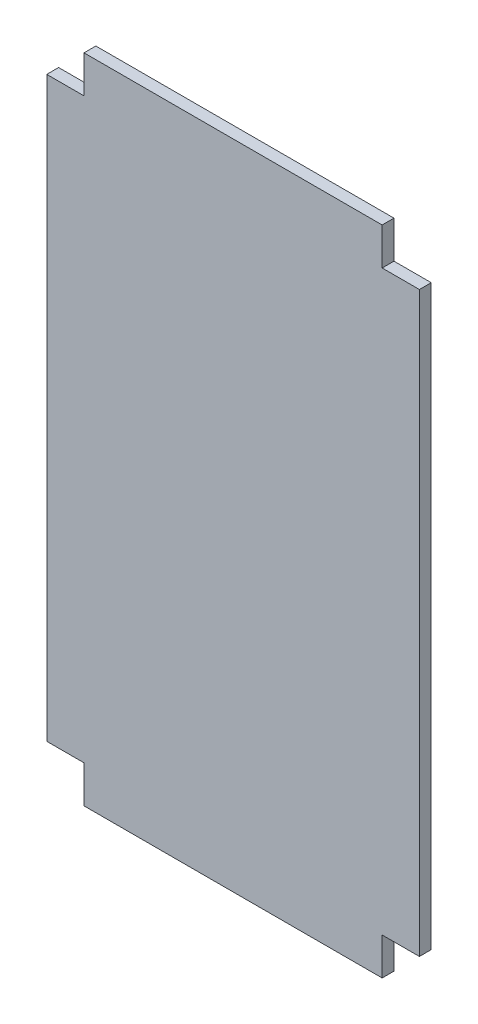
ISO-10303-21;
HEADER;
FILE_DESCRIPTION(('STEP AP214'),'2;1');
FILE_NAME('part.step','',(''),(''),'','','');
FILE_SCHEMA(('AUTOMOTIVE_DESIGN { 1 0 10303 214 1 1 1 1 }'));
ENDSEC;
DATA;
#1=APPLICATION_CONTEXT('core data for automotive mechanical design processes');
#2=APPLICATION_PROTOCOL_DEFINITION('international standard','automotive_design',2000,#1);
#3=PRODUCT_CONTEXT('',#1,'mechanical');
#4=PRODUCT('Part','Part','',(#3));
#5=PRODUCT_RELATED_PRODUCT_CATEGORY('part','',(#4));
#6=PRODUCT_DEFINITION_FORMATION('','',#4);
#7=PRODUCT_DEFINITION_CONTEXT('part definition',#1,'design');
#8=PRODUCT_DEFINITION('design','',#6,#7);
#9=PRODUCT_DEFINITION_SHAPE('','',#8);
#10=(LENGTH_UNIT() NAMED_UNIT(*) SI_UNIT(.MILLI.,.METRE.));
#11=(NAMED_UNIT(*) PLANE_ANGLE_UNIT() SI_UNIT($,.RADIAN.));
#12=(NAMED_UNIT(*) SI_UNIT($,.STERADIAN.) SOLID_ANGLE_UNIT());
#13=UNCERTAINTY_MEASURE_WITH_UNIT(LENGTH_MEASURE(1.E-05),#10,'distance_accuracy_value','');
#14=(GEOMETRIC_REPRESENTATION_CONTEXT(3) GLOBAL_UNCERTAINTY_ASSIGNED_CONTEXT((#13)) GLOBAL_UNIT_ASSIGNED_CONTEXT((#10,
#11,#12)) REPRESENTATION_CONTEXT('',''));
#15=CARTESIAN_POINT('',(0.,0.,0.));
#16=DIRECTION('',(0.,0.,1.));
#17=DIRECTION('',(1.,0.,0.));
#18=AXIS2_PLACEMENT_3D('',#15,#16,#17);
#19=CARTESIAN_POINT('',(0.,-175.,6.35));
#20=DIRECTION('',(0.,-1.,0.));
#21=DIRECTION('',(0.,0.,-1.));
#22=AXIS2_PLACEMENT_3D('',#19,#20,#21);
#23=PLANE('',#22);
#24=DIRECTION('',(-1.,0.,0.));
#25=VECTOR('',#24,1.);
#26=CARTESIAN_POINT('',(0.,-175.,0.));
#27=LINE('',#26,#25);
#28=CARTESIAN_POINT('',(25.,-175.,0.));
#29=VERTEX_POINT('',#28);
#30=CARTESIAN_POINT('',(5.,-175.,0.));
#31=VERTEX_POINT('',#30);
#32=EDGE_CURVE('E152',#29,#31,#27,.T.);
#33=ORIENTED_EDGE('',*,*,#32,.F.);
#34=DIRECTION('',(0.,0.,-1.));
#35=VECTOR('',#34,1.);
#36=CARTESIAN_POINT('',(25.,-175.,6.35));
#37=LINE('',#36,#35);
#38=CARTESIAN_POINT('',(25.,-175.,6.35));
#39=VERTEX_POINT('',#38);
#40=EDGE_CURVE('E11',#39,#29,#37,.T.);
#41=ORIENTED_EDGE('',*,*,#40,.F.);
#42=DIRECTION('',(-1.,0.,0.));
#43=VECTOR('',#42,1.);
#44=CARTESIAN_POINT('',(0.,-175.,6.35));
#45=LINE('',#44,#43);
#46=CARTESIAN_POINT('',(5.,-175.,6.35));
#47=VERTEX_POINT('',#46);
#48=EDGE_CURVE('E182',#39,#47,#45,.T.);
#49=ORIENTED_EDGE('',*,*,#48,.T.);
#50=DIRECTION('',(0.,0.,-1.));
#51=VECTOR('',#50,1.);
#52=CARTESIAN_POINT('',(5.,-175.,6.35));
#53=LINE('',#52,#51);
#54=EDGE_CURVE('E98',#47,#31,#53,.T.);
#55=ORIENTED_EDGE('',*,*,#54,.T.);
#56=EDGE_LOOP('',(#33,#41,#49,#55));
#57=FACE_BOUND('',#56,.T.);
#58=ADVANCED_FACE('F35',(#57),#23,.T.);
#59=CARTESIAN_POINT('',(25.,0.,6.35));
#60=DIRECTION('',(1.,0.,0.));
#61=DIRECTION('',(0.,1.,0.));
#62=AXIS2_PLACEMENT_3D('',#59,#60,#61);
#63=PLANE('',#62);
#64=DIRECTION('',(0.,-1.,0.));
#65=VECTOR('',#64,1.);
#66=CARTESIAN_POINT('',(25.,0.,0.));
#67=LINE('',#66,#65);
#68=CARTESIAN_POINT('',(25.,135.,0.));
#69=VERTEX_POINT('',#68);
#70=EDGE_CURVE('E155',#69,#29,#67,.T.);
#71=ORIENTED_EDGE('',*,*,#70,.F.);
#72=DIRECTION('',(0.,0.,-1.));
#73=VECTOR('',#72,1.);
#74=CARTESIAN_POINT('',(25.,135.,6.35));
#75=LINE('',#74,#73);
#76=CARTESIAN_POINT('',(25.,135.,6.35));
#77=VERTEX_POINT('',#76);
#78=EDGE_CURVE('E43',#77,#69,#75,.T.);
#79=ORIENTED_EDGE('',*,*,#78,.F.);
#80=DIRECTION('',(0.,-1.,0.));
#81=VECTOR('',#80,1.);
#82=CARTESIAN_POINT('',(25.,0.,6.35));
#83=LINE('',#82,#81);
#84=EDGE_CURVE('E222',#77,#39,#83,.T.);
#85=ORIENTED_EDGE('',*,*,#84,.T.);
#86=ORIENTED_EDGE('',*,*,#40,.T.);
#87=EDGE_LOOP('',(#71,#79,#85,#86));
#88=FACE_BOUND('',#87,.T.);
#89=ADVANCED_FACE('F207',(#88),#63,.T.);
#90=CARTESIAN_POINT('',(0.,135.,6.35));
#91=DIRECTION('',(0.,1.,0.));
#92=DIRECTION('',(0.,0.,1.));
#93=AXIS2_PLACEMENT_3D('',#90,#91,#92);
#94=PLANE('',#93);
#95=DIRECTION('',(1.,0.,0.));
#96=VECTOR('',#95,1.);
#97=CARTESIAN_POINT('',(0.,135.,0.));
#98=LINE('',#97,#96);
#99=CARTESIAN_POINT('',(5.,135.,0.));
#100=VERTEX_POINT('',#99);
#101=EDGE_CURVE('E158',#100,#69,#98,.T.);
#102=ORIENTED_EDGE('',*,*,#101,.F.);
#103=DIRECTION('',(0.,0.,-1.));
#104=VECTOR('',#103,1.);
#105=CARTESIAN_POINT('',(5.,135.,6.35));
#106=LINE('',#105,#104);
#107=CARTESIAN_POINT('',(5.,135.,6.35));
#108=VERTEX_POINT('',#107);
#109=EDGE_CURVE('E196',#108,#100,#106,.T.);
#110=ORIENTED_EDGE('',*,*,#109,.F.);
#111=DIRECTION('',(1.,0.,0.));
#112=VECTOR('',#111,1.);
#113=CARTESIAN_POINT('',(0.,135.,6.35));
#114=LINE('',#113,#112);
#115=EDGE_CURVE('E203',#108,#77,#114,.T.);
#116=ORIENTED_EDGE('',*,*,#115,.T.);
#117=ORIENTED_EDGE('',*,*,#78,.T.);
#118=EDGE_LOOP('',(#102,#110,#116,#117));
#119=FACE_BOUND('',#118,.T.);
#120=ADVANCED_FACE('F201',(#119),#94,.T.);
#121=CARTESIAN_POINT('',(5.,0.,6.35));
#122=DIRECTION('',(-1.,0.,0.));
#123=DIRECTION('',(0.,0.,1.));
#124=AXIS2_PLACEMENT_3D('',#121,#122,#123);
#125=PLANE('',#124);
#126=DIRECTION('',(0.,1.,0.));
#127=VECTOR('',#126,1.);
#128=CARTESIAN_POINT('',(5.,0.,0.));
#129=LINE('',#128,#127);
#130=CARTESIAN_POINT('',(5.,155.,0.));
#131=VERTEX_POINT('',#130);
#132=EDGE_CURVE('E161',#100,#131,#129,.T.);
#133=ORIENTED_EDGE('',*,*,#132,.T.);
#134=DIRECTION('',(0.,0.,-1.));
#135=VECTOR('',#134,1.);
#136=CARTESIAN_POINT('',(5.,155.,6.35));
#137=LINE('',#136,#135);
#138=CARTESIAN_POINT('',(5.,155.,6.35));
#139=VERTEX_POINT('',#138);
#140=EDGE_CURVE('E194',#139,#131,#137,.T.);
#141=ORIENTED_EDGE('',*,*,#140,.F.);
#142=DIRECTION('',(0.,1.,0.));
#143=VECTOR('',#142,1.);
#144=CARTESIAN_POINT('',(5.,0.,6.35));
#145=LINE('',#144,#143);
#146=EDGE_CURVE('E218',#108,#139,#145,.T.);
#147=ORIENTED_EDGE('',*,*,#146,.F.);
#148=ORIENTED_EDGE('',*,*,#109,.T.);
#149=EDGE_LOOP('',(#133,#141,#147,#148));
#150=FACE_BOUND('',#149,.T.);
#151=ADVANCED_FACE('F215',(#150),#125,.F.);
#152=CARTESIAN_POINT('',(0.,155.,6.35));
#153=DIRECTION('',(0.,1.,0.));
#154=DIRECTION('',(0.,0.,1.));
#155=AXIS2_PLACEMENT_3D('',#152,#153,#154);
#156=PLANE('',#155);
#157=DIRECTION('',(1.,0.,0.));
#158=VECTOR('',#157,1.);
#159=CARTESIAN_POINT('',(0.,155.,0.));
#160=LINE('',#159,#158);
#161=CARTESIAN_POINT('',(-155.,155.,0.));
#162=VERTEX_POINT('',#161);
#163=EDGE_CURVE('E164',#162,#131,#160,.T.);
#164=ORIENTED_EDGE('',*,*,#163,.F.);
#165=DIRECTION('',(0.,0.,-1.));
#166=VECTOR('',#165,1.);
#167=CARTESIAN_POINT('',(-155.,155.,6.35));
#168=LINE('',#167,#166);
#169=CARTESIAN_POINT('',(-155.,155.,6.35));
#170=VERTEX_POINT('',#169);
#171=EDGE_CURVE('E192',#170,#162,#168,.T.);
#172=ORIENTED_EDGE('',*,*,#171,.F.);
#173=DIRECTION('',(1.,0.,0.));
#174=VECTOR('',#173,1.);
#175=CARTESIAN_POINT('',(0.,155.,6.35));
#176=LINE('',#175,#174);
#177=EDGE_CURVE('E220',#170,#139,#176,.T.);
#178=ORIENTED_EDGE('',*,*,#177,.T.);
#179=ORIENTED_EDGE('',*,*,#140,.T.);
#180=EDGE_LOOP('',(#164,#172,#178,#179));
#181=FACE_BOUND('',#180,.T.);
#182=ADVANCED_FACE('F325',(#181),#156,.T.);
#183=CARTESIAN_POINT('',(-155.,0.,6.35));
#184=DIRECTION('',(1.,0.,0.));
#185=DIRECTION('',(0.,0.,-1.));
#186=AXIS2_PLACEMENT_3D('',#183,#184,#185);
#187=PLANE('',#186);
#188=DIRECTION('',(0.,-1.,0.));
#189=VECTOR('',#188,1.);
#190=CARTESIAN_POINT('',(-155.,0.,0.));
#191=LINE('',#190,#189);
#192=CARTESIAN_POINT('',(-155.,135.,0.));
#193=VERTEX_POINT('',#192);
#194=EDGE_CURVE('E167',#162,#193,#191,.T.);
#195=ORIENTED_EDGE('',*,*,#194,.T.);
#196=DIRECTION('',(0.,0.,-1.));
#197=VECTOR('',#196,1.);
#198=CARTESIAN_POINT('',(-155.,135.,6.35));
#199=LINE('',#198,#197);
#200=CARTESIAN_POINT('',(-155.,135.,6.35));
#201=VERTEX_POINT('',#200);
#202=EDGE_CURVE('E190',#201,#193,#199,.T.);
#203=ORIENTED_EDGE('',*,*,#202,.F.);
#204=DIRECTION('',(0.,-1.,0.));
#205=VECTOR('',#204,1.);
#206=CARTESIAN_POINT('',(-155.,0.,6.35));
#207=LINE('',#206,#205);
#208=EDGE_CURVE('E228',#170,#201,#207,.T.);
#209=ORIENTED_EDGE('',*,*,#208,.F.);
#210=ORIENTED_EDGE('',*,*,#171,.T.);
#211=EDGE_LOOP('',(#195,#203,#209,#210));
#212=FACE_BOUND('',#211,.T.);
#213=ADVANCED_FACE('F315',(#212),#187,.F.);
#214=CARTESIAN_POINT('',(0.,135.,6.35));
#215=DIRECTION('',(0.,1.,0.));
#216=DIRECTION('',(0.,0.,1.));
#217=AXIS2_PLACEMENT_3D('',#214,#215,#216);
#218=PLANE('',#217);
#219=DIRECTION('',(1.,0.,0.));
#220=VECTOR('',#219,1.);
#221=CARTESIAN_POINT('',(0.,135.,0.));
#222=LINE('',#221,#220);
#223=CARTESIAN_POINT('',(-175.,135.,0.));
#224=VERTEX_POINT('',#223);
#225=EDGE_CURVE('E170',#224,#193,#222,.T.);
#226=ORIENTED_EDGE('',*,*,#225,.F.);
#227=DIRECTION('',(0.,0.,-1.));
#228=VECTOR('',#227,1.);
#229=CARTESIAN_POINT('',(-175.,135.,6.35));
#230=LINE('',#229,#228);
#231=CARTESIAN_POINT('',(-175.,135.,6.35));
#232=VERTEX_POINT('',#231);
#233=EDGE_CURVE('E188',#232,#224,#230,.T.);
#234=ORIENTED_EDGE('',*,*,#233,.F.);
#235=DIRECTION('',(1.,0.,0.));
#236=VECTOR('',#235,1.);
#237=CARTESIAN_POINT('',(0.,135.,6.35));
#238=LINE('',#237,#236);
#239=EDGE_CURVE('E230',#232,#201,#238,.T.);
#240=ORIENTED_EDGE('',*,*,#239,.T.);
#241=ORIENTED_EDGE('',*,*,#202,.T.);
#242=EDGE_LOOP('',(#226,#234,#240,#241));
#243=FACE_BOUND('',#242,.T.);
#244=ADVANCED_FACE('F243',(#243),#218,.T.);
#245=CARTESIAN_POINT('',(-175.,0.,6.35));
#246=DIRECTION('',(-1.,0.,0.));
#247=DIRECTION('',(0.,0.,1.));
#248=AXIS2_PLACEMENT_3D('',#245,#246,#247);
#249=PLANE('',#248);
#250=DIRECTION('',(0.,1.,0.));
#251=VECTOR('',#250,1.);
#252=CARTESIAN_POINT('',(-175.,0.,0.));
#253=LINE('',#252,#251);
#254=CARTESIAN_POINT('',(-175.,-175.,0.));
#255=VERTEX_POINT('',#254);
#256=EDGE_CURVE('E173',#255,#224,#253,.T.);
#257=ORIENTED_EDGE('',*,*,#256,.F.);
#258=DIRECTION('',(0.,0.,-1.));
#259=VECTOR('',#258,1.);
#260=CARTESIAN_POINT('',(-175.,-175.,6.35));
#261=LINE('',#260,#259);
#262=CARTESIAN_POINT('',(-175.,-175.,6.35));
#263=VERTEX_POINT('',#262);
#264=EDGE_CURVE('E186',#263,#255,#261,.T.);
#265=ORIENTED_EDGE('',*,*,#264,.F.);
#266=DIRECTION('',(0.,1.,0.));
#267=VECTOR('',#266,1.);
#268=CARTESIAN_POINT('',(-175.,0.,6.35));
#269=LINE('',#268,#267);
#270=EDGE_CURVE('E233',#263,#232,#269,.T.);
#271=ORIENTED_EDGE('',*,*,#270,.T.);
#272=ORIENTED_EDGE('',*,*,#233,.T.);
#273=EDGE_LOOP('',(#257,#265,#271,#272));
#274=FACE_BOUND('',#273,.T.);
#275=ADVANCED_FACE('F237',(#274),#249,.T.);
#276=CARTESIAN_POINT('',(0.,-175.,6.35));
#277=DIRECTION('',(0.,1.,0.));
#278=DIRECTION('',(0.,0.,1.));
#279=AXIS2_PLACEMENT_3D('',#276,#277,#278);
#280=PLANE('',#279);
#281=DIRECTION('',(1.,0.,0.));
#282=VECTOR('',#281,1.);
#283=CARTESIAN_POINT('',(0.,-175.,0.));
#284=LINE('',#283,#282);
#285=CARTESIAN_POINT('',(-155.,-175.,0.));
#286=VERTEX_POINT('',#285);
#287=EDGE_CURVE('E176',#255,#286,#284,.T.);
#288=ORIENTED_EDGE('',*,*,#287,.T.);
#289=DIRECTION('',(0.,0.,-1.));
#290=VECTOR('',#289,1.);
#291=CARTESIAN_POINT('',(-155.,-175.,6.35));
#292=LINE('',#291,#290);
#293=CARTESIAN_POINT('',(-155.,-175.,6.35));
#294=VERTEX_POINT('',#293);
#295=EDGE_CURVE('E144',#294,#286,#292,.T.);
#296=ORIENTED_EDGE('',*,*,#295,.F.);
#297=DIRECTION('',(1.,0.,0.));
#298=VECTOR('',#297,1.);
#299=CARTESIAN_POINT('',(0.,-175.,6.35));
#300=LINE('',#299,#298);
#301=EDGE_CURVE('E135',#263,#294,#300,.T.);
#302=ORIENTED_EDGE('',*,*,#301,.F.);
#303=ORIENTED_EDGE('',*,*,#264,.T.);
#304=EDGE_LOOP('',(#288,#296,#302,#303));
#305=FACE_BOUND('',#304,.T.);
#306=ADVANCED_FACE('F246',(#305),#280,.F.);
#307=CARTESIAN_POINT('',(-155.,0.,6.35));
#308=DIRECTION('',(1.,0.,0.));
#309=DIRECTION('',(0.,0.,-1.));
#310=AXIS2_PLACEMENT_3D('',#307,#308,#309);
#311=PLANE('',#310);
#312=DIRECTION('',(0.,-1.,0.));
#313=VECTOR('',#312,1.);
#314=CARTESIAN_POINT('',(-155.,0.,0.));
#315=LINE('',#314,#313);
#316=CARTESIAN_POINT('',(-155.,-195.,0.));
#317=VERTEX_POINT('',#316);
#318=EDGE_CURVE('E143',#286,#317,#315,.T.);
#319=ORIENTED_EDGE('',*,*,#318,.T.);
#320=DIRECTION('',(0.,0.,-1.));
#321=VECTOR('',#320,1.);
#322=CARTESIAN_POINT('',(-155.,-195.,6.35));
#323=LINE('',#322,#321);
#324=CARTESIAN_POINT('',(-155.,-195.,6.35));
#325=VERTEX_POINT('',#324);
#326=EDGE_CURVE('E140',#325,#317,#323,.T.);
#327=ORIENTED_EDGE('',*,*,#326,.F.);
#328=DIRECTION('',(0.,-1.,0.));
#329=VECTOR('',#328,1.);
#330=CARTESIAN_POINT('',(-155.,0.,6.35));
#331=LINE('',#330,#329);
#332=EDGE_CURVE('E128',#294,#325,#331,.T.);
#333=ORIENTED_EDGE('',*,*,#332,.F.);
#334=ORIENTED_EDGE('',*,*,#295,.T.);
#335=EDGE_LOOP('',(#319,#327,#333,#334));
#336=FACE_BOUND('',#335,.T.);
#337=ADVANCED_FACE('F141',(#336),#311,.F.);
#338=CARTESIAN_POINT('',(0.,-195.,6.35));
#339=DIRECTION('',(0.,1.,0.));
#340=DIRECTION('',(0.,0.,1.));
#341=AXIS2_PLACEMENT_3D('',#338,#339,#340);
#342=PLANE('',#341);
#343=DIRECTION('',(1.,0.,0.));
#344=VECTOR('',#343,1.);
#345=CARTESIAN_POINT('',(0.,-195.,0.));
#346=LINE('',#345,#344);
#347=CARTESIAN_POINT('',(5.,-195.,0.));
#348=VERTEX_POINT('',#347);
#349=EDGE_CURVE('E91',#317,#348,#346,.T.);
#350=ORIENTED_EDGE('',*,*,#349,.T.);
#351=DIRECTION('',(0.,0.,-1.));
#352=VECTOR('',#351,1.);
#353=CARTESIAN_POINT('',(5.,-195.,6.35));
#354=LINE('',#353,#352);
#355=CARTESIAN_POINT('',(5.,-195.,6.35));
#356=VERTEX_POINT('',#355);
#357=EDGE_CURVE('E145',#356,#348,#354,.T.);
#358=ORIENTED_EDGE('',*,*,#357,.F.);
#359=DIRECTION('',(1.,0.,0.));
#360=VECTOR('',#359,1.);
#361=CARTESIAN_POINT('',(0.,-195.,6.35));
#362=LINE('',#361,#360);
#363=EDGE_CURVE('E132',#325,#356,#362,.T.);
#364=ORIENTED_EDGE('',*,*,#363,.F.);
#365=ORIENTED_EDGE('',*,*,#326,.T.);
#366=EDGE_LOOP('',(#350,#358,#364,#365));
#367=FACE_BOUND('',#366,.T.);
#368=ADVANCED_FACE('F147',(#367),#342,.F.);
#369=CARTESIAN_POINT('',(5.,0.,6.35));
#370=DIRECTION('',(-1.,0.,0.));
#371=DIRECTION('',(0.,0.,1.));
#372=AXIS2_PLACEMENT_3D('',#369,#370,#371);
#373=PLANE('',#372);
#374=DIRECTION('',(0.,1.,0.));
#375=VECTOR('',#374,1.);
#376=CARTESIAN_POINT('',(5.,0.,0.));
#377=LINE('',#376,#375);
#378=EDGE_CURVE('E180',#348,#31,#377,.T.);
#379=ORIENTED_EDGE('',*,*,#378,.T.);
#380=ORIENTED_EDGE('',*,*,#54,.F.);
#381=DIRECTION('',(0.,1.,0.));
#382=VECTOR('',#381,1.);
#383=CARTESIAN_POINT('',(5.,0.,6.35));
#384=LINE('',#383,#382);
#385=EDGE_CURVE('E51',#356,#47,#384,.T.);
#386=ORIENTED_EDGE('',*,*,#385,.F.);
#387=ORIENTED_EDGE('',*,*,#357,.T.);
#388=EDGE_LOOP('',(#379,#380,#386,#387));
#389=FACE_BOUND('',#388,.T.);
#390=ADVANCED_FACE('F261',(#389),#373,.F.);
#391=CARTESIAN_POINT('',(0.,0.,6.35));
#392=DIRECTION('',(0.,0.,1.));
#393=DIRECTION('',(1.,0.,0.));
#394=AXIS2_PLACEMENT_3D('',#391,#392,#393);
#395=PLANE('',#394);
#396=ORIENTED_EDGE('',*,*,#48,.F.);
#397=ORIENTED_EDGE('',*,*,#84,.F.);
#398=ORIENTED_EDGE('',*,*,#115,.F.);
#399=ORIENTED_EDGE('',*,*,#146,.T.);
#400=ORIENTED_EDGE('',*,*,#177,.F.);
#401=ORIENTED_EDGE('',*,*,#208,.T.);
#402=ORIENTED_EDGE('',*,*,#239,.F.);
#403=ORIENTED_EDGE('',*,*,#270,.F.);
#404=ORIENTED_EDGE('',*,*,#301,.T.);
#405=ORIENTED_EDGE('',*,*,#332,.T.);
#406=ORIENTED_EDGE('',*,*,#363,.T.);
#407=ORIENTED_EDGE('',*,*,#385,.T.);
#408=EDGE_LOOP('',(#396,#397,#398,#399,#400,#401,#402,#403,#404,#405,#406,#407));
#409=FACE_BOUND('',#408,.T.);
#410=ADVANCED_FACE('F130',(#409),#395,.T.);
#411=CARTESIAN_POINT('',(0.,0.,0.));
#412=DIRECTION('',(0.,0.,1.));
#413=DIRECTION('',(1.,0.,0.));
#414=AXIS2_PLACEMENT_3D('',#411,#412,#413);
#415=PLANE('',#414);
#416=ORIENTED_EDGE('',*,*,#32,.T.);
#417=ORIENTED_EDGE('',*,*,#378,.F.);
#418=ORIENTED_EDGE('',*,*,#349,.F.);
#419=ORIENTED_EDGE('',*,*,#318,.F.);
#420=ORIENTED_EDGE('',*,*,#287,.F.);
#421=ORIENTED_EDGE('',*,*,#256,.T.);
#422=ORIENTED_EDGE('',*,*,#225,.T.);
#423=ORIENTED_EDGE('',*,*,#194,.F.);
#424=ORIENTED_EDGE('',*,*,#163,.T.);
#425=ORIENTED_EDGE('',*,*,#132,.F.);
#426=ORIENTED_EDGE('',*,*,#101,.T.);
#427=ORIENTED_EDGE('',*,*,#70,.T.);
#428=EDGE_LOOP('',(#416,#417,#418,#419,#420,#421,#422,#423,#424,#425,#426,#427));
#429=FACE_BOUND('',#428,.T.);
#430=ADVANCED_FACE('F210',(#429),#415,.F.);
#431=CLOSED_SHELL('',(#58,#89,#120,#151,#182,#213,#244,#275,#306,#337,#368,#390,#410,#430));
#432=MANIFOLD_SOLID_BREP('B2',#431);
#433=ADVANCED_BREP_SHAPE_REPRESENTATION('',(#18,#432),#14);
#434=SHAPE_DEFINITION_REPRESENTATION(#9,#433);
ENDSEC;
END-ISO-10303-21;
